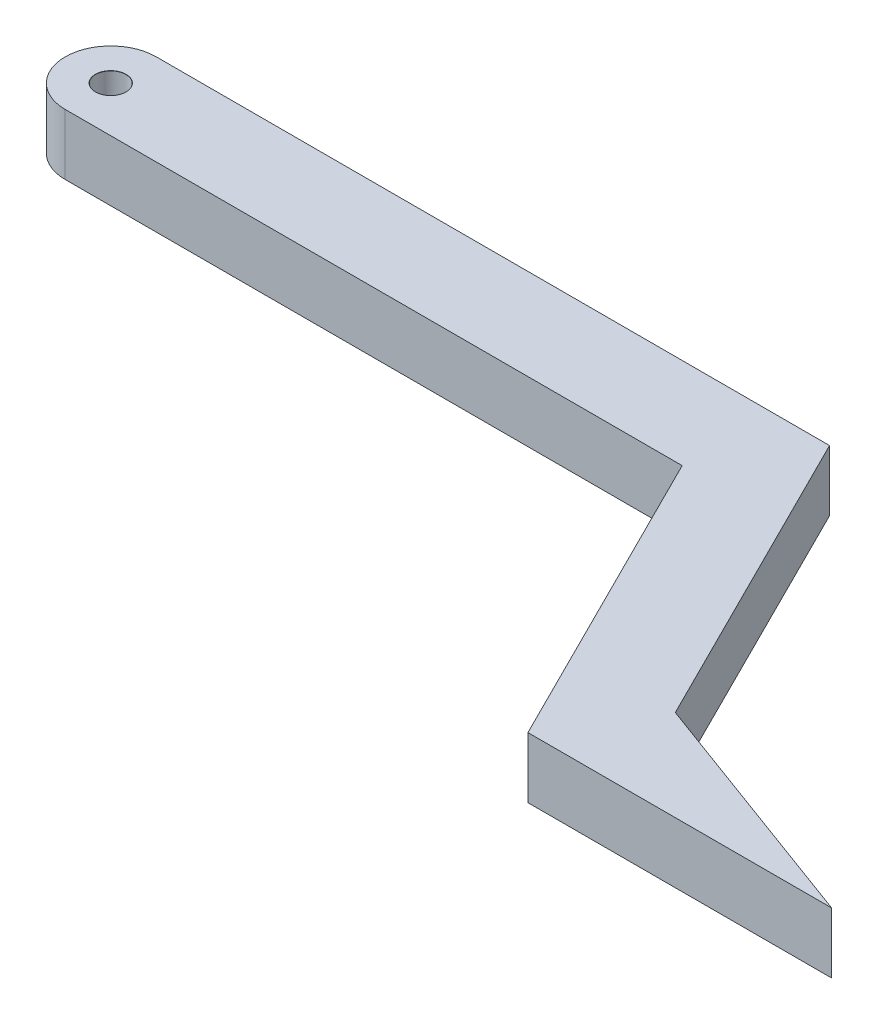
ISO-10303-21;
HEADER;
FILE_DESCRIPTION(('STEP AP214'),'2;1');
FILE_NAME('part.step','',(''),(''),'','','');
FILE_SCHEMA(('AUTOMOTIVE_DESIGN { 1 0 10303 214 1 1 1 1 }'));
ENDSEC;
DATA;
#1=APPLICATION_CONTEXT('core data for automotive mechanical design processes');
#2=APPLICATION_PROTOCOL_DEFINITION('international standard','automotive_design',2000,#1);
#3=PRODUCT_CONTEXT('',#1,'mechanical');
#4=PRODUCT('Part','Part','',(#3));
#5=PRODUCT_RELATED_PRODUCT_CATEGORY('part','',(#4));
#6=PRODUCT_DEFINITION_FORMATION('','',#4);
#7=PRODUCT_DEFINITION_CONTEXT('part definition',#1,'design');
#8=PRODUCT_DEFINITION('design','',#6,#7);
#9=PRODUCT_DEFINITION_SHAPE('','',#8);
#10=(LENGTH_UNIT() NAMED_UNIT(*) SI_UNIT(.MILLI.,.METRE.));
#11=(NAMED_UNIT(*) PLANE_ANGLE_UNIT() SI_UNIT($,.RADIAN.));
#12=(NAMED_UNIT(*) SI_UNIT($,.STERADIAN.) SOLID_ANGLE_UNIT());
#13=UNCERTAINTY_MEASURE_WITH_UNIT(LENGTH_MEASURE(1.E-05),#10,'distance_accuracy_value','');
#14=(GEOMETRIC_REPRESENTATION_CONTEXT(3) GLOBAL_UNCERTAINTY_ASSIGNED_CONTEXT((#13)) GLOBAL_UNIT_ASSIGNED_CONTEXT((#10,
#11,#12)) REPRESENTATION_CONTEXT('',''));
#15=CARTESIAN_POINT('',(0.,0.,0.));
#16=DIRECTION('',(0.,0.,1.));
#17=DIRECTION('',(1.,0.,0.));
#18=AXIS2_PLACEMENT_3D('',#15,#16,#17);
#19=CARTESIAN_POINT('',(0.,0.,0.));
#20=DIRECTION('',(0.,-1.,0.));
#21=DIRECTION('',(0.,0.,-1.));
#22=AXIS2_PLACEMENT_3D('',#19,#20,#21);
#23=PLANE('',#22);
#24=DIRECTION('',(1.,0.,0.));
#25=VECTOR('',#24,1.);
#26=CARTESIAN_POINT('',(0.,0.,0.));
#27=LINE('',#26,#25);
#28=CARTESIAN_POINT('',(0.,0.,0.));
#29=VERTEX_POINT('',#28);
#30=CARTESIAN_POINT('',(101.6,0.,0.));
#31=VERTEX_POINT('',#30);
#32=EDGE_CURVE('E142',#29,#31,#27,.T.);
#33=ORIENTED_EDGE('',*,*,#32,.F.);
#34=CARTESIAN_POINT('',(0.,0.,-7.5));
#35=DIRECTION('',(0.,1.,0.));
#36=DIRECTION('',(0.,0.,1.));
#37=AXIS2_PLACEMENT_3D('',#34,#35,#36);
#38=CIRCLE('',#37,7.5);
#39=CARTESIAN_POINT('',(0.,0.,-15.));
#40=VERTEX_POINT('',#39);
#41=EDGE_CURVE('E146',#40,#29,#38,.T.);
#42=ORIENTED_EDGE('',*,*,#41,.F.);
#43=DIRECTION('',(-1.,0.,0.));
#44=VECTOR('',#43,1.);
#45=CARTESIAN_POINT('',(0.,0.,-15.));
#46=LINE('',#45,#44);
#47=CARTESIAN_POINT('',(110.872938296131,0.,-15.));
#48=VERTEX_POINT('',#47);
#49=EDGE_CURVE('E93',#48,#40,#46,.T.);
#50=ORIENTED_EDGE('',*,*,#49,.F.);
#51=DIRECTION('',(-0.447004033669538,0.,-0.89453194123137));
#52=VECTOR('',#51,1.);
#53=CARTESIAN_POINT('',(110.872938296131,0.,-15.));
#54=LINE('',#53,#52);
#55=CARTESIAN_POINT('',(136.243205185325,0.,35.7702668891941));
#56=VERTEX_POINT('',#55);
#57=EDGE_CURVE('E87',#56,#48,#54,.T.);
#58=ORIENTED_EDGE('',*,*,#57,.F.);
#59=DIRECTION('',(-0.938378292429126,0.,-0.34560986718813));
#60=VECTOR('',#59,1.);
#61=CARTESIAN_POINT('',(176.970266889194,0.,50.7702668891941));
#62=LINE('',#61,#60);
#63=CARTESIAN_POINT('',(176.970266889194,0.,50.7702668891941));
#64=VERTEX_POINT('',#63);
#65=EDGE_CURVE('E129',#64,#56,#62,.T.);
#66=ORIENTED_EDGE('',*,*,#65,.F.);
#67=DIRECTION('',(1.,0.,0.));
#68=VECTOR('',#67,1.);
#69=CARTESIAN_POINT('',(126.970266889194,0.,50.7702668891941));
#70=LINE('',#69,#68);
#71=CARTESIAN_POINT('',(126.970266889194,0.,50.7702668891941));
#72=VERTEX_POINT('',#71);
#73=EDGE_CURVE('E149',#72,#64,#70,.T.);
#74=ORIENTED_EDGE('',*,*,#73,.F.);
#75=DIRECTION('',(0.447004033669538,0.,0.89453194123137));
#76=VECTOR('',#75,1.);
#77=CARTESIAN_POINT('',(101.6,0.,0.));
#78=LINE('',#77,#76);
#79=EDGE_CURVE('E145',#31,#72,#78,.T.);
#80=ORIENTED_EDGE('',*,*,#79,.F.);
#81=EDGE_LOOP('',(#33,#42,#50,#58,#66,#74,#80));
#82=FACE_BOUND('',#81,.T.);
#83=CARTESIAN_POINT('',(0.,0.,-7.5));
#84=DIRECTION('',(0.,1.,0.));
#85=DIRECTION('',(0.,0.,1.));
#86=AXIS2_PLACEMENT_3D('',#83,#84,#85);
#87=CIRCLE('',#86,2.5);
#88=CARTESIAN_POINT('',(0.,0.,-5.));
#89=VERTEX_POINT('',#88);
#90=EDGE_CURVE('E192',#89,#89,#87,.T.);
#91=ORIENTED_EDGE('',*,*,#90,.T.);
#92=EDGE_LOOP('',(#91));
#93=FACE_BOUND('',#92,.T.);
#94=ADVANCED_FACE('F45',(#82,#93),#23,.T.);
#95=CARTESIAN_POINT('',(0.,10.,0.));
#96=DIRECTION('',(0.,-1.,0.));
#97=DIRECTION('',(0.,0.,-1.));
#98=AXIS2_PLACEMENT_3D('',#95,#96,#97);
#99=PLANE('',#98);
#100=DIRECTION('',(-1.,0.,0.));
#101=VECTOR('',#100,1.);
#102=CARTESIAN_POINT('',(0.,10.,-15.));
#103=LINE('',#102,#101);
#104=CARTESIAN_POINT('',(110.872938296131,10.,-15.));
#105=VERTEX_POINT('',#104);
#106=CARTESIAN_POINT('',(0.,10.,-15.));
#107=VERTEX_POINT('',#106);
#108=EDGE_CURVE('E63',#105,#107,#103,.T.);
#109=ORIENTED_EDGE('',*,*,#108,.T.);
#110=CARTESIAN_POINT('',(0.,10.,-7.5));
#111=DIRECTION('',(0.,1.,0.));
#112=DIRECTION('',(0.,0.,1.));
#113=AXIS2_PLACEMENT_3D('',#110,#111,#112);
#114=CIRCLE('',#113,7.5);
#115=CARTESIAN_POINT('',(0.,10.,0.));
#116=VERTEX_POINT('',#115);
#117=EDGE_CURVE('E189',#107,#116,#114,.T.);
#118=ORIENTED_EDGE('',*,*,#117,.T.);
#119=DIRECTION('',(1.,0.,0.));
#120=VECTOR('',#119,1.);
#121=CARTESIAN_POINT('',(0.,10.,0.));
#122=LINE('',#121,#120);
#123=CARTESIAN_POINT('',(101.6,10.,0.));
#124=VERTEX_POINT('',#123);
#125=EDGE_CURVE('E101',#116,#124,#122,.T.);
#126=ORIENTED_EDGE('',*,*,#125,.T.);
#127=DIRECTION('',(0.447004033669538,0.,0.89453194123137));
#128=VECTOR('',#127,1.);
#129=CARTESIAN_POINT('',(101.6,10.,0.));
#130=LINE('',#129,#128);
#131=CARTESIAN_POINT('',(126.970266889194,10.,50.7702668891941));
#132=VERTEX_POINT('',#131);
#133=EDGE_CURVE('E174',#124,#132,#130,.T.);
#134=ORIENTED_EDGE('',*,*,#133,.T.);
#135=DIRECTION('',(1.,0.,0.));
#136=VECTOR('',#135,1.);
#137=CARTESIAN_POINT('',(126.970266889194,10.,50.7702668891941));
#138=LINE('',#137,#136);
#139=CARTESIAN_POINT('',(176.970266889194,10.,50.7702668891941));
#140=VERTEX_POINT('',#139);
#141=EDGE_CURVE('E120',#132,#140,#138,.T.);
#142=ORIENTED_EDGE('',*,*,#141,.T.);
#143=DIRECTION('',(-0.938378292429126,0.,-0.34560986718813));
#144=VECTOR('',#143,1.);
#145=CARTESIAN_POINT('',(176.970266889194,10.,50.7702668891941));
#146=LINE('',#145,#144);
#147=CARTESIAN_POINT('',(136.243205185325,10.,35.7702668891941));
#148=VERTEX_POINT('',#147);
#149=EDGE_CURVE('E113',#140,#148,#146,.T.);
#150=ORIENTED_EDGE('',*,*,#149,.T.);
#151=DIRECTION('',(-0.447004033669538,0.,-0.89453194123137));
#152=VECTOR('',#151,1.);
#153=CARTESIAN_POINT('',(110.872938296131,10.,-15.));
#154=LINE('',#153,#152);
#155=EDGE_CURVE('E118',#148,#105,#154,.T.);
#156=ORIENTED_EDGE('',*,*,#155,.T.);
#157=EDGE_LOOP('',(#109,#118,#126,#134,#142,#150,#156));
#158=FACE_BOUND('',#157,.T.);
#159=CARTESIAN_POINT('',(0.,10.,-7.5));
#160=DIRECTION('',(0.,1.,0.));
#161=DIRECTION('',(0.,0.,1.));
#162=AXIS2_PLACEMENT_3D('',#159,#160,#161);
#163=CIRCLE('',#162,2.525);
#164=CARTESIAN_POINT('',(0.,10.,-4.975));
#165=VERTEX_POINT('',#164);
#166=EDGE_CURVE('E202',#165,#165,#163,.T.);
#167=ORIENTED_EDGE('',*,*,#166,.F.);
#168=EDGE_LOOP('',(#167));
#169=FACE_BOUND('',#168,.T.);
#170=ADVANCED_FACE('F115',(#158,#169),#99,.F.);
#171=CARTESIAN_POINT('',(0.,10.,0.));
#172=DIRECTION('',(0.,0.,-1.));
#173=DIRECTION('',(-1.,0.,0.));
#174=AXIS2_PLACEMENT_3D('',#171,#172,#173);
#175=PLANE('',#174);
#176=ORIENTED_EDGE('',*,*,#32,.T.);
#177=DIRECTION('',(0.,-1.,0.));
#178=VECTOR('',#177,1.);
#179=CARTESIAN_POINT('',(101.6,10.,0.));
#180=LINE('',#179,#178);
#181=EDGE_CURVE('E55',#124,#31,#180,.T.);
#182=ORIENTED_EDGE('',*,*,#181,.F.);
#183=ORIENTED_EDGE('',*,*,#125,.F.);
#184=DIRECTION('',(0.,-1.,0.));
#185=VECTOR('',#184,1.);
#186=CARTESIAN_POINT('',(0.,10.,0.));
#187=LINE('',#186,#185);
#188=EDGE_CURVE('E11',#116,#29,#187,.T.);
#189=ORIENTED_EDGE('',*,*,#188,.T.);
#190=EDGE_LOOP('',(#176,#182,#183,#189));
#191=FACE_BOUND('',#190,.T.);
#192=ADVANCED_FACE('F47',(#191),#175,.F.);
#193=CARTESIAN_POINT('',(101.6,10.,0.));
#194=DIRECTION('',(0.89453194123137,0.,-0.447004033669538));
#195=DIRECTION('',(-0.447004033669538,0.,-0.89453194123137));
#196=AXIS2_PLACEMENT_3D('',#193,#194,#195);
#197=PLANE('',#196);
#198=ORIENTED_EDGE('',*,*,#79,.T.);
#199=DIRECTION('',(0.,-1.,0.));
#200=VECTOR('',#199,1.);
#201=CARTESIAN_POINT('',(126.970266889194,10.,50.7702668891941));
#202=LINE('',#201,#200);
#203=EDGE_CURVE('E164',#132,#72,#202,.T.);
#204=ORIENTED_EDGE('',*,*,#203,.F.);
#205=ORIENTED_EDGE('',*,*,#133,.F.);
#206=ORIENTED_EDGE('',*,*,#181,.T.);
#207=EDGE_LOOP('',(#198,#204,#205,#206));
#208=FACE_BOUND('',#207,.T.);
#209=ADVANCED_FACE('F172',(#208),#197,.F.);
#210=CARTESIAN_POINT('',(126.970266889194,10.,50.7702668891941));
#211=DIRECTION('',(0.,0.,-1.));
#212=DIRECTION('',(-1.,0.,0.));
#213=AXIS2_PLACEMENT_3D('',#210,#211,#212);
#214=PLANE('',#213);
#215=ORIENTED_EDGE('',*,*,#73,.T.);
#216=DIRECTION('',(0.,-1.,0.));
#217=VECTOR('',#216,1.);
#218=CARTESIAN_POINT('',(176.970266889194,10.,50.7702668891941));
#219=LINE('',#218,#217);
#220=EDGE_CURVE('E131',#140,#64,#219,.T.);
#221=ORIENTED_EDGE('',*,*,#220,.F.);
#222=ORIENTED_EDGE('',*,*,#141,.F.);
#223=ORIENTED_EDGE('',*,*,#203,.T.);
#224=EDGE_LOOP('',(#215,#221,#222,#223));
#225=FACE_BOUND('',#224,.T.);
#226=ADVANCED_FACE('F182',(#225),#214,.F.);
#227=CARTESIAN_POINT('',(176.970266889194,10.,50.7702668891941));
#228=DIRECTION('',(-0.34560986718813,0.,0.938378292429126));
#229=DIRECTION('',(0.938378292429126,0.,0.34560986718813));
#230=AXIS2_PLACEMENT_3D('',#227,#228,#229);
#231=PLANE('',#230);
#232=ORIENTED_EDGE('',*,*,#65,.T.);
#233=DIRECTION('',(0.,-1.,0.));
#234=VECTOR('',#233,1.);
#235=CARTESIAN_POINT('',(136.243205185325,10.,35.7702668891941));
#236=LINE('',#235,#234);
#237=EDGE_CURVE('E126',#148,#56,#236,.T.);
#238=ORIENTED_EDGE('',*,*,#237,.F.);
#239=ORIENTED_EDGE('',*,*,#149,.F.);
#240=ORIENTED_EDGE('',*,*,#220,.T.);
#241=EDGE_LOOP('',(#232,#238,#239,#240));
#242=FACE_BOUND('',#241,.T.);
#243=ADVANCED_FACE('F127',(#242),#231,.F.);
#244=CARTESIAN_POINT('',(110.872938296131,10.,-15.));
#245=DIRECTION('',(-0.89453194123137,0.,0.447004033669538));
#246=DIRECTION('',(0.447004033669538,0.,0.89453194123137));
#247=AXIS2_PLACEMENT_3D('',#244,#245,#246);
#248=PLANE('',#247);
#249=ORIENTED_EDGE('',*,*,#57,.T.);
#250=DIRECTION('',(0.,-1.,0.));
#251=VECTOR('',#250,1.);
#252=CARTESIAN_POINT('',(110.872938296131,10.,-15.));
#253=LINE('',#252,#251);
#254=EDGE_CURVE('E132',#105,#48,#253,.T.);
#255=ORIENTED_EDGE('',*,*,#254,.F.);
#256=ORIENTED_EDGE('',*,*,#155,.F.);
#257=ORIENTED_EDGE('',*,*,#237,.T.);
#258=EDGE_LOOP('',(#249,#255,#256,#257));
#259=FACE_BOUND('',#258,.T.);
#260=ADVANCED_FACE('F134',(#259),#248,.F.);
#261=CARTESIAN_POINT('',(0.,10.,-15.));
#262=DIRECTION('',(0.,0.,1.));
#263=DIRECTION('',(1.,0.,0.));
#264=AXIS2_PLACEMENT_3D('',#261,#262,#263);
#265=PLANE('',#264);
#266=ORIENTED_EDGE('',*,*,#49,.T.);
#267=DIRECTION('',(0.,-1.,0.));
#268=VECTOR('',#267,1.);
#269=CARTESIAN_POINT('',(0.,10.,-15.));
#270=LINE('',#269,#268);
#271=EDGE_CURVE('E138',#107,#40,#270,.T.);
#272=ORIENTED_EDGE('',*,*,#271,.F.);
#273=ORIENTED_EDGE('',*,*,#108,.F.);
#274=ORIENTED_EDGE('',*,*,#254,.T.);
#275=EDGE_LOOP('',(#266,#272,#273,#274));
#276=FACE_BOUND('',#275,.T.);
#277=ADVANCED_FACE('F220',(#276),#265,.F.);
#278=CARTESIAN_POINT('',(0.,0.,-7.5));
#279=DIRECTION('',(0.,1.,0.));
#280=DIRECTION('',(0.,0.,1.));
#281=AXIS2_PLACEMENT_3D('',#278,#279,#280);
#282=CYLINDRICAL_SURFACE('',#281,7.5);
#283=ORIENTED_EDGE('',*,*,#117,.F.);
#284=ORIENTED_EDGE('',*,*,#271,.T.);
#285=ORIENTED_EDGE('',*,*,#41,.T.);
#286=ORIENTED_EDGE('',*,*,#188,.F.);
#287=EDGE_LOOP('',(#283,#284,#285,#286));
#288=FACE_BOUND('',#287,.T.);
#289=ADVANCED_FACE('F217',(#288),#282,.T.);
#290=CARTESIAN_POINT('',(0.,10.,-7.5));
#291=DIRECTION('',(0.,1.,0.));
#292=DIRECTION('',(0.,0.,1.));
#293=AXIS2_PLACEMENT_3D('',#290,#291,#292);
#294=CYLINDRICAL_SURFACE('',#293,2.5);
#295=ORIENTED_EDGE('',*,*,#90,.F.);
#296=EDGE_LOOP('',(#295));
#297=FACE_BOUND('',#296,.T.);
#298=CARTESIAN_POINT('',(0.,9.975,-7.5));
#299=DIRECTION('',(0.,1.,0.));
#300=DIRECTION('',(0.,0.,1.));
#301=AXIS2_PLACEMENT_3D('',#298,#299,#300);
#302=CIRCLE('',#301,2.5);
#303=CARTESIAN_POINT('',(0.,9.975,-5.));
#304=VERTEX_POINT('',#303);
#305=EDGE_CURVE('E198',#304,#304,#302,.T.);
#306=ORIENTED_EDGE('',*,*,#305,.T.);
#307=EDGE_LOOP('',(#306));
#308=FACE_BOUND('',#307,.T.);
#309=ADVANCED_FACE('F262',(#297,#308),#294,.F.);
#310=CARTESIAN_POINT('',(0.,10.,-7.5));
#311=DIRECTION('',(0.,1.,0.));
#312=DIRECTION('',(0.,0.,1.));
#313=AXIS2_PLACEMENT_3D('',#310,#311,#312);
#314=CONICAL_SURFACE('',#313,2.525,0.785398163397483);
#315=ORIENTED_EDGE('',*,*,#305,.F.);
#316=EDGE_LOOP('',(#315));
#317=FACE_BOUND('',#316,.T.);
#318=ORIENTED_EDGE('',*,*,#166,.T.);
#319=EDGE_LOOP('',(#318));
#320=FACE_BOUND('',#319,.T.);
#321=ADVANCED_FACE('F207',(#317,#320),#314,.F.);
#322=CLOSED_SHELL('',(#94,#170,#192,#209,#226,#243,#260,#277,#289,#309,#321));
#323=MANIFOLD_SOLID_BREP('B2',#322);
#324=ADVANCED_BREP_SHAPE_REPRESENTATION('',(#18,#323),#14);
#325=SHAPE_DEFINITION_REPRESENTATION(#9,#324);
ENDSEC;
END-ISO-10303-21;
